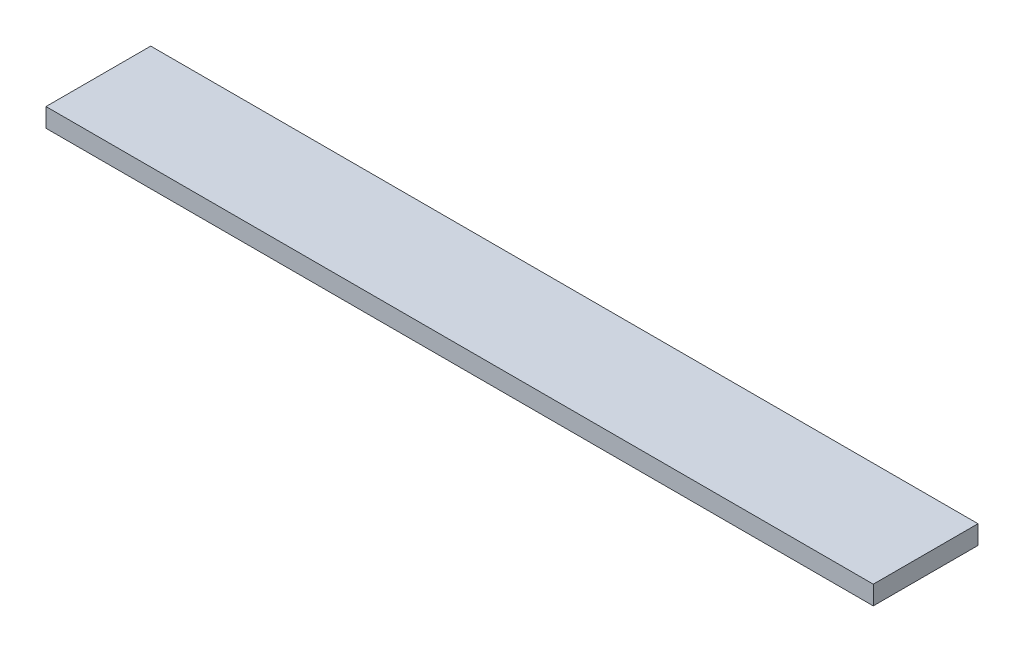
ISO-10303-21;
HEADER;
FILE_DESCRIPTION(('STEP AP214'),'2;1');
FILE_NAME('part.step','',(''),(''),'','','');
FILE_SCHEMA(('AUTOMOTIVE_DESIGN { 1 0 10303 214 1 1 1 1 }'));
ENDSEC;
DATA;
#1=APPLICATION_CONTEXT('core data for automotive mechanical design processes');
#2=APPLICATION_PROTOCOL_DEFINITION('international standard','automotive_design',2000,#1);
#3=PRODUCT_CONTEXT('',#1,'mechanical');
#4=PRODUCT('Part','Part','',(#3));
#5=PRODUCT_RELATED_PRODUCT_CATEGORY('part','',(#4));
#6=PRODUCT_DEFINITION_FORMATION('','',#4);
#7=PRODUCT_DEFINITION_CONTEXT('part definition',#1,'design');
#8=PRODUCT_DEFINITION('design','',#6,#7);
#9=PRODUCT_DEFINITION_SHAPE('','',#8);
#10=(LENGTH_UNIT() NAMED_UNIT(*) SI_UNIT(.MILLI.,.METRE.));
#11=(NAMED_UNIT(*) PLANE_ANGLE_UNIT() SI_UNIT($,.RADIAN.));
#12=(NAMED_UNIT(*) SI_UNIT($,.STERADIAN.) SOLID_ANGLE_UNIT());
#13=UNCERTAINTY_MEASURE_WITH_UNIT(LENGTH_MEASURE(1.E-05),#10,'distance_accuracy_value','');
#14=(GEOMETRIC_REPRESENTATION_CONTEXT(3) GLOBAL_UNCERTAINTY_ASSIGNED_CONTEXT((#13)) GLOBAL_UNIT_ASSIGNED_CONTEXT((#10,
#11,#12)) REPRESENTATION_CONTEXT('',''));
#15=CARTESIAN_POINT('',(0.,0.,0.));
#16=DIRECTION('',(0.,0.,1.));
#17=DIRECTION('',(1.,0.,0.));
#18=AXIS2_PLACEMENT_3D('',#15,#16,#17);
#19=CARTESIAN_POINT('',(395.,18.,50.));
#20=DIRECTION('',(-1.,0.,0.));
#21=DIRECTION('',(0.,0.,1.));
#22=AXIS2_PLACEMENT_3D('',#19,#20,#21);
#23=PLANE('',#22);
#24=DIRECTION('',(0.,0.,-1.));
#25=VECTOR('',#24,1.);
#26=CARTESIAN_POINT('',(395.,0.,50.));
#27=LINE('',#26,#25);
#28=CARTESIAN_POINT('',(395.,0.,50.));
#29=VERTEX_POINT('',#28);
#30=CARTESIAN_POINT('',(395.,0.,-50.));
#31=VERTEX_POINT('',#30);
#32=EDGE_CURVE('E95',#29,#31,#27,.T.);
#33=ORIENTED_EDGE('',*,*,#32,.T.);
#34=DIRECTION('',(0.,-1.,0.));
#35=VECTOR('',#34,1.);
#36=CARTESIAN_POINT('',(395.,18.,-50.));
#37=LINE('',#36,#35);
#38=CARTESIAN_POINT('',(395.,18.,-50.));
#39=VERTEX_POINT('',#38);
#40=EDGE_CURVE('E11',#39,#31,#37,.T.);
#41=ORIENTED_EDGE('',*,*,#40,.F.);
#42=DIRECTION('',(0.,0.,-1.));
#43=VECTOR('',#42,1.);
#44=CARTESIAN_POINT('',(395.,18.,50.));
#45=LINE('',#44,#43);
#46=CARTESIAN_POINT('',(395.,18.,50.));
#47=VERTEX_POINT('',#46);
#48=EDGE_CURVE('E83',#47,#39,#45,.T.);
#49=ORIENTED_EDGE('',*,*,#48,.F.);
#50=DIRECTION('',(0.,-1.,0.));
#51=VECTOR('',#50,1.);
#52=CARTESIAN_POINT('',(395.,18.,50.));
#53=LINE('',#52,#51);
#54=EDGE_CURVE('E91',#47,#29,#53,.T.);
#55=ORIENTED_EDGE('',*,*,#54,.T.);
#56=EDGE_LOOP('',(#33,#41,#49,#55));
#57=FACE_BOUND('',#56,.T.);
#58=ADVANCED_FACE('F32',(#57),#23,.F.);
#59=CARTESIAN_POINT('',(-395.,18.,-50.));
#60=DIRECTION('',(0.,0.,1.));
#61=DIRECTION('',(1.,0.,0.));
#62=AXIS2_PLACEMENT_3D('',#59,#60,#61);
#63=PLANE('',#62);
#64=DIRECTION('',(-1.,0.,0.));
#65=VECTOR('',#64,1.);
#66=CARTESIAN_POINT('',(-395.,0.,-50.));
#67=LINE('',#66,#65);
#68=CARTESIAN_POINT('',(-395.,0.,-50.));
#69=VERTEX_POINT('',#68);
#70=EDGE_CURVE('E87',#31,#69,#67,.T.);
#71=ORIENTED_EDGE('',*,*,#70,.T.);
#72=DIRECTION('',(0.,-1.,0.));
#73=VECTOR('',#72,1.);
#74=CARTESIAN_POINT('',(-395.,18.,-50.));
#75=LINE('',#74,#73);
#76=CARTESIAN_POINT('',(-395.,18.,-50.));
#77=VERTEX_POINT('',#76);
#78=EDGE_CURVE('E40',#77,#69,#75,.T.);
#79=ORIENTED_EDGE('',*,*,#78,.F.);
#80=DIRECTION('',(-1.,0.,0.));
#81=VECTOR('',#80,1.);
#82=CARTESIAN_POINT('',(-395.,18.,-50.));
#83=LINE('',#82,#81);
#84=EDGE_CURVE('E78',#39,#77,#83,.T.);
#85=ORIENTED_EDGE('',*,*,#84,.F.);
#86=ORIENTED_EDGE('',*,*,#40,.T.);
#87=EDGE_LOOP('',(#71,#79,#85,#86));
#88=FACE_BOUND('',#87,.T.);
#89=ADVANCED_FACE('F86',(#88),#63,.F.);
#90=CARTESIAN_POINT('',(-395.,18.,50.));
#91=DIRECTION('',(1.,0.,0.));
#92=DIRECTION('',(0.,0.,-1.));
#93=AXIS2_PLACEMENT_3D('',#90,#91,#92);
#94=PLANE('',#93);
#95=DIRECTION('',(0.,0.,1.));
#96=VECTOR('',#95,1.);
#97=CARTESIAN_POINT('',(-395.,0.,50.));
#98=LINE('',#97,#96);
#99=CARTESIAN_POINT('',(-395.,0.,50.));
#100=VERTEX_POINT('',#99);
#101=EDGE_CURVE('E65',#69,#100,#98,.T.);
#102=ORIENTED_EDGE('',*,*,#101,.T.);
#103=DIRECTION('',(0.,-1.,0.));
#104=VECTOR('',#103,1.);
#105=CARTESIAN_POINT('',(-395.,18.,50.));
#106=LINE('',#105,#104);
#107=CARTESIAN_POINT('',(-395.,18.,50.));
#108=VERTEX_POINT('',#107);
#109=EDGE_CURVE('E88',#108,#100,#106,.T.);
#110=ORIENTED_EDGE('',*,*,#109,.F.);
#111=DIRECTION('',(0.,0.,1.));
#112=VECTOR('',#111,1.);
#113=CARTESIAN_POINT('',(-395.,18.,50.));
#114=LINE('',#113,#112);
#115=EDGE_CURVE('E81',#77,#108,#114,.T.);
#116=ORIENTED_EDGE('',*,*,#115,.F.);
#117=ORIENTED_EDGE('',*,*,#78,.T.);
#118=EDGE_LOOP('',(#102,#110,#116,#117));
#119=FACE_BOUND('',#118,.T.);
#120=ADVANCED_FACE('F89',(#119),#94,.F.);
#121=CARTESIAN_POINT('',(-395.,18.,50.));
#122=DIRECTION('',(0.,0.,-1.));
#123=DIRECTION('',(-1.,0.,0.));
#124=AXIS2_PLACEMENT_3D('',#121,#122,#123);
#125=PLANE('',#124);
#126=DIRECTION('',(1.,0.,0.));
#127=VECTOR('',#126,1.);
#128=CARTESIAN_POINT('',(-395.,0.,50.));
#129=LINE('',#128,#127);
#130=EDGE_CURVE('E71',#100,#29,#129,.T.);
#131=ORIENTED_EDGE('',*,*,#130,.T.);
#132=ORIENTED_EDGE('',*,*,#54,.F.);
#133=DIRECTION('',(1.,0.,0.));
#134=VECTOR('',#133,1.);
#135=CARTESIAN_POINT('',(-395.,18.,50.));
#136=LINE('',#135,#134);
#137=EDGE_CURVE('E48',#108,#47,#136,.T.);
#138=ORIENTED_EDGE('',*,*,#137,.F.);
#139=ORIENTED_EDGE('',*,*,#109,.T.);
#140=EDGE_LOOP('',(#131,#132,#138,#139));
#141=FACE_BOUND('',#140,.T.);
#142=ADVANCED_FACE('F102',(#141),#125,.F.);
#143=CARTESIAN_POINT('',(0.,18.,0.));
#144=DIRECTION('',(0.,-1.,0.));
#145=DIRECTION('',(0.,0.,-1.));
#146=AXIS2_PLACEMENT_3D('',#143,#144,#145);
#147=PLANE('',#146);
#148=ORIENTED_EDGE('',*,*,#48,.T.);
#149=ORIENTED_EDGE('',*,*,#84,.T.);
#150=ORIENTED_EDGE('',*,*,#115,.T.);
#151=ORIENTED_EDGE('',*,*,#137,.T.);
#152=EDGE_LOOP('',(#148,#149,#150,#151));
#153=FACE_BOUND('',#152,.T.);
#154=ADVANCED_FACE('F79',(#153),#147,.F.);
#155=CARTESIAN_POINT('',(0.,0.,0.));
#156=DIRECTION('',(0.,-1.,0.));
#157=DIRECTION('',(0.,0.,-1.));
#158=AXIS2_PLACEMENT_3D('',#155,#156,#157);
#159=PLANE('',#158);
#160=ORIENTED_EDGE('',*,*,#32,.F.);
#161=ORIENTED_EDGE('',*,*,#130,.F.);
#162=ORIENTED_EDGE('',*,*,#101,.F.);
#163=ORIENTED_EDGE('',*,*,#70,.F.);
#164=EDGE_LOOP('',(#160,#161,#162,#163));
#165=FACE_BOUND('',#164,.T.);
#166=ADVANCED_FACE('F105',(#165),#159,.T.);
#167=CLOSED_SHELL('',(#58,#89,#120,#142,#154,#166));
#168=MANIFOLD_SOLID_BREP('B2',#167);
#169=ADVANCED_BREP_SHAPE_REPRESENTATION('',(#18,#168),#14);
#170=SHAPE_DEFINITION_REPRESENTATION(#9,#169);
ENDSEC;
END-ISO-10303-21;
